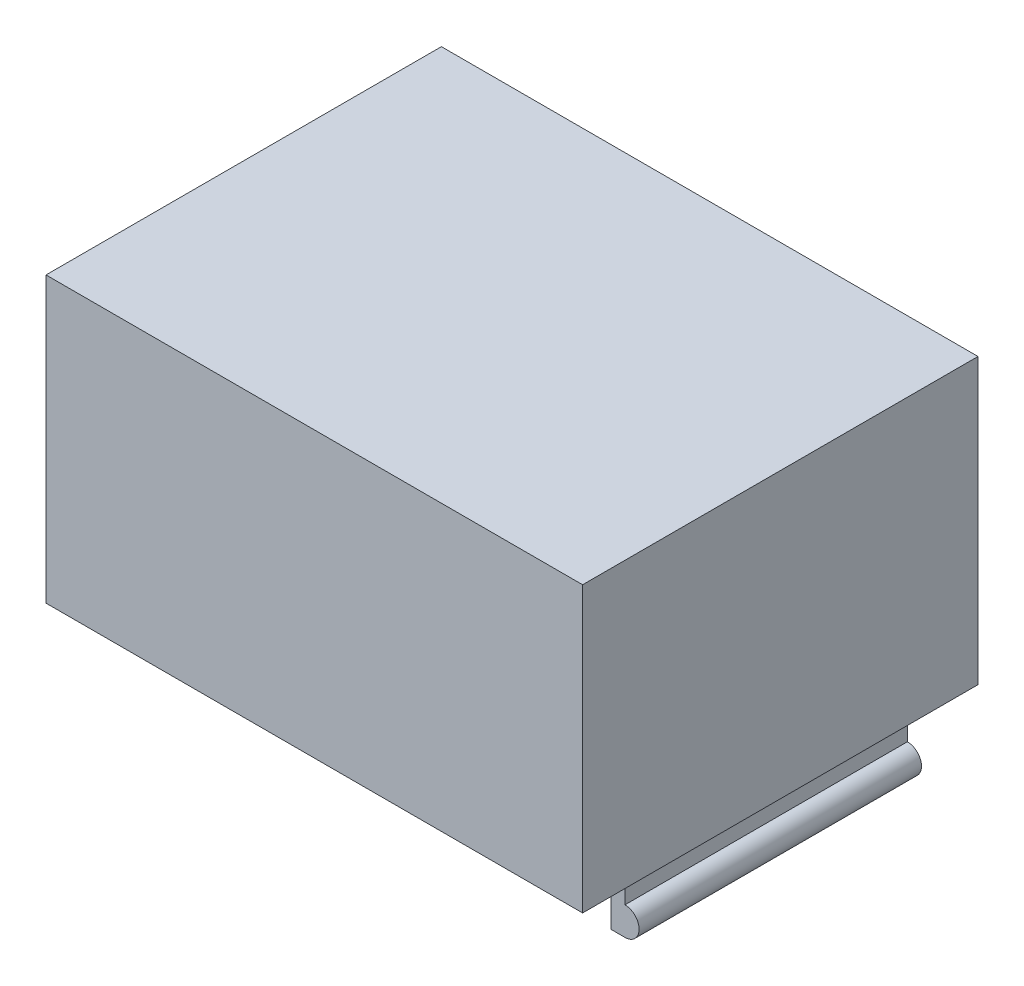
ISO-10303-21;
HEADER;
FILE_DESCRIPTION(('STEP AP214'),'2;1');
FILE_NAME('part.step','',(''),(''),'','','');
FILE_SCHEMA(('AUTOMOTIVE_DESIGN { 1 0 10303 214 1 1 1 1 }'));
ENDSEC;
DATA;
#1=APPLICATION_CONTEXT('core data for automotive mechanical design processes');
#2=APPLICATION_PROTOCOL_DEFINITION('international standard','automotive_design',2000,#1);
#3=PRODUCT_CONTEXT('',#1,'mechanical');
#4=PRODUCT('Part','Part','',(#3));
#5=PRODUCT_RELATED_PRODUCT_CATEGORY('part','',(#4));
#6=PRODUCT_DEFINITION_FORMATION('','',#4);
#7=PRODUCT_DEFINITION_CONTEXT('part definition',#1,'design');
#8=PRODUCT_DEFINITION('design','',#6,#7);
#9=PRODUCT_DEFINITION_SHAPE('','',#8);
#10=(LENGTH_UNIT() NAMED_UNIT(*) SI_UNIT(.MILLI.,.METRE.));
#11=(NAMED_UNIT(*) PLANE_ANGLE_UNIT() SI_UNIT($,.RADIAN.));
#12=(NAMED_UNIT(*) SI_UNIT($,.STERADIAN.) SOLID_ANGLE_UNIT());
#13=UNCERTAINTY_MEASURE_WITH_UNIT(LENGTH_MEASURE(1.E-05),#10,'distance_accuracy_value','');
#14=(GEOMETRIC_REPRESENTATION_CONTEXT(3) GLOBAL_UNCERTAINTY_ASSIGNED_CONTEXT((#13)) GLOBAL_UNIT_ASSIGNED_CONTEXT((#10,
#11,#12)) REPRESENTATION_CONTEXT('',''));
#15=CARTESIAN_POINT('',(0.,0.,0.));
#16=DIRECTION('',(0.,0.,1.));
#17=DIRECTION('',(1.,0.,0.));
#18=AXIS2_PLACEMENT_3D('',#15,#16,#17);
#19=CARTESIAN_POINT('',(0.,-25.5651,17.78));
#20=DIRECTION('',(0.,1.,0.));
#21=DIRECTION('',(0.,0.,1.));
#22=AXIS2_PLACEMENT_3D('',#19,#20,#21);
#23=PLANE('',#22);
#24=DIRECTION('',(0.,0.,-1.));
#25=VECTOR('',#24,1.);
#26=CARTESIAN_POINT('',(2.54,-25.5651,17.78));
#27=LINE('',#26,#25);
#28=CARTESIAN_POINT('',(2.54,-25.5651,-12.7));
#29=VERTEX_POINT('',#28);
#30=CARTESIAN_POINT('',(2.54,-25.5651,-15.24));
#31=VERTEX_POINT('',#30);
#32=EDGE_CURVE('E292',#29,#31,#27,.T.);
#33=ORIENTED_EDGE('',*,*,#32,.F.);
#34=DIRECTION('',(-1.,0.,0.));
#35=VECTOR('',#34,1.);
#36=CARTESIAN_POINT('',(1.27,-25.5651,-12.7));
#37=LINE('',#36,#35);
#38=CARTESIAN_POINT('',(1.27,-25.5651,-12.7));
#39=VERTEX_POINT('',#38);
#40=EDGE_CURVE('E63',#29,#39,#37,.T.);
#41=ORIENTED_EDGE('',*,*,#40,.T.);
#42=DIRECTION('',(0.,0.,-1.));
#43=VECTOR('',#42,1.);
#44=CARTESIAN_POINT('',(1.27,-25.5651,12.7));
#45=LINE('',#44,#43);
#46=CARTESIAN_POINT('',(1.27,-25.5651,12.7));
#47=VERTEX_POINT('',#46);
#48=EDGE_CURVE('E589',#47,#39,#45,.T.);
#49=ORIENTED_EDGE('',*,*,#48,.F.);
#50=DIRECTION('',(-1.,0.,0.));
#51=VECTOR('',#50,1.);
#52=CARTESIAN_POINT('',(1.27,-25.5651,12.7));
#53=LINE('',#52,#51);
#54=CARTESIAN_POINT('',(2.54,-25.5651,12.7));
#55=VERTEX_POINT('',#54);
#56=EDGE_CURVE('E187',#55,#47,#53,.T.);
#57=ORIENTED_EDGE('',*,*,#56,.F.);
#58=CARTESIAN_POINT('',(2.54,-25.5651,15.24));
#59=VERTEX_POINT('',#58);
#60=EDGE_CURVE('E286',#59,#55,#27,.T.);
#61=ORIENTED_EDGE('',*,*,#60,.F.);
#62=DIRECTION('',(1.,0.,0.));
#63=VECTOR('',#62,1.);
#64=CARTESIAN_POINT('',(0.,-25.5651,15.24));
#65=LINE('',#64,#63);
#66=CARTESIAN_POINT('',(45.72,-25.5651,15.24));
#67=VERTEX_POINT('',#66);
#68=EDGE_CURVE('E265',#59,#67,#65,.T.);
#69=ORIENTED_EDGE('',*,*,#68,.T.);
#70=DIRECTION('',(0.,0.,-1.));
#71=VECTOR('',#70,1.);
#72=CARTESIAN_POINT('',(45.72,-25.5651,17.78));
#73=LINE('',#72,#71);
#74=CARTESIAN_POINT('',(45.72,-25.5651,12.7));
#75=VERTEX_POINT('',#74);
#76=EDGE_CURVE('E293',#67,#75,#73,.T.);
#77=ORIENTED_EDGE('',*,*,#76,.T.);
#78=DIRECTION('',(-1.,0.,0.));
#79=VECTOR('',#78,1.);
#80=CARTESIAN_POINT('',(46.99,-25.5651,12.7));
#81=LINE('',#80,#79);
#82=CARTESIAN_POINT('',(46.99,-25.5651,12.7));
#83=VERTEX_POINT('',#82);
#84=EDGE_CURVE('E227',#83,#75,#81,.T.);
#85=ORIENTED_EDGE('',*,*,#84,.F.);
#86=DIRECTION('',(0.,0.,-1.));
#87=VECTOR('',#86,1.);
#88=CARTESIAN_POINT('',(46.99,-25.5651,12.7));
#89=LINE('',#88,#87);
#90=CARTESIAN_POINT('',(46.99,-25.5651,-12.7));
#91=VERTEX_POINT('',#90);
#92=EDGE_CURVE('E222',#83,#91,#89,.T.);
#93=ORIENTED_EDGE('',*,*,#92,.T.);
#94=DIRECTION('',(-1.,0.,0.));
#95=VECTOR('',#94,1.);
#96=CARTESIAN_POINT('',(46.99,-25.5651,-12.7));
#97=LINE('',#96,#95);
#98=CARTESIAN_POINT('',(45.72,-25.5651,-12.7));
#99=VERTEX_POINT('',#98);
#100=EDGE_CURVE('E67',#91,#99,#97,.T.);
#101=ORIENTED_EDGE('',*,*,#100,.T.);
#102=CARTESIAN_POINT('',(45.72,-25.5651,-15.24));
#103=VERTEX_POINT('',#102);
#104=EDGE_CURVE('E276',#99,#103,#73,.T.);
#105=ORIENTED_EDGE('',*,*,#104,.T.);
#106=DIRECTION('',(1.,0.,0.));
#107=VECTOR('',#106,1.);
#108=CARTESIAN_POINT('',(0.,-25.5651,-15.24));
#109=LINE('',#108,#107);
#110=EDGE_CURVE('E256',#31,#103,#109,.T.);
#111=ORIENTED_EDGE('',*,*,#110,.F.);
#112=EDGE_LOOP('',(#33,#41,#49,#57,#61,#69,#77,#85,#93,#101,#105,#111));
#113=FACE_BOUND('',#112,.T.);
#114=DIRECTION('',(1.,0.,0.));
#115=VECTOR('',#114,1.);
#116=CARTESIAN_POINT('',(0.,-25.5651,-17.78));
#117=LINE('',#116,#115);
#118=CARTESIAN_POINT('',(0.,-25.5651,-17.78));
#119=VERTEX_POINT('',#118);
#120=CARTESIAN_POINT('',(48.26,-25.5651,-17.78));
#121=VERTEX_POINT('',#120);
#122=EDGE_CURVE('E325',#119,#121,#117,.T.);
#123=ORIENTED_EDGE('',*,*,#122,.T.);
#124=DIRECTION('',(0.,0.,-1.));
#125=VECTOR('',#124,1.);
#126=CARTESIAN_POINT('',(48.26,-25.5651,17.78));
#127=LINE('',#126,#125);
#128=CARTESIAN_POINT('',(48.26,-25.5651,17.78));
#129=VERTEX_POINT('',#128);
#130=EDGE_CURVE('E336',#129,#121,#127,.T.);
#131=ORIENTED_EDGE('',*,*,#130,.F.);
#132=DIRECTION('',(1.,0.,0.));
#133=VECTOR('',#132,1.);
#134=CARTESIAN_POINT('',(0.,-25.5651,17.78));
#135=LINE('',#134,#133);
#136=CARTESIAN_POINT('',(0.,-25.5651,17.78));
#137=VERTEX_POINT('',#136);
#138=EDGE_CURVE('E308',#137,#129,#135,.T.);
#139=ORIENTED_EDGE('',*,*,#138,.F.);
#140=DIRECTION('',(0.,0.,-1.));
#141=VECTOR('',#140,1.);
#142=CARTESIAN_POINT('',(0.,-25.5651,17.78));
#143=LINE('',#142,#141);
#144=EDGE_CURVE('E53',#137,#119,#143,.T.);
#145=ORIENTED_EDGE('',*,*,#144,.T.);
#146=EDGE_LOOP('',(#123,#131,#139,#145));
#147=FACE_BOUND('',#146,.T.);
#148=ADVANCED_FACE('F44',(#113,#147),#23,.F.);
#149=CARTESIAN_POINT('',(0.,0.,17.78));
#150=DIRECTION('',(1.,0.,0.));
#151=DIRECTION('',(0.,1.,0.));
#152=AXIS2_PLACEMENT_3D('',#149,#150,#151);
#153=PLANE('',#152);
#154=DIRECTION('',(0.,-1.,0.));
#155=VECTOR('',#154,1.);
#156=CARTESIAN_POINT('',(0.,0.,-17.78));
#157=LINE('',#156,#155);
#158=CARTESIAN_POINT('',(0.,0.,-17.78));
#159=VERTEX_POINT('',#158);
#160=EDGE_CURVE('E289',#159,#119,#157,.T.);
#161=ORIENTED_EDGE('',*,*,#160,.T.);
#162=ORIENTED_EDGE('',*,*,#144,.F.);
#163=DIRECTION('',(0.,-1.,0.));
#164=VECTOR('',#163,1.);
#165=CARTESIAN_POINT('',(0.,0.,17.78));
#166=LINE('',#165,#164);
#167=CARTESIAN_POINT('',(0.,0.,17.78));
#168=VERTEX_POINT('',#167);
#169=EDGE_CURVE('E305',#168,#137,#166,.T.);
#170=ORIENTED_EDGE('',*,*,#169,.F.);
#171=DIRECTION('',(0.,0.,-1.));
#172=VECTOR('',#171,1.);
#173=CARTESIAN_POINT('',(0.,0.,17.78));
#174=LINE('',#173,#172);
#175=EDGE_CURVE('E318',#168,#159,#174,.T.);
#176=ORIENTED_EDGE('',*,*,#175,.T.);
#177=EDGE_LOOP('',(#161,#162,#170,#176));
#178=FACE_BOUND('',#177,.T.);
#179=ADVANCED_FACE('F50',(#178),#153,.F.);
#180=CARTESIAN_POINT('',(48.26,0.,17.78));
#181=DIRECTION('',(1.,0.,0.));
#182=DIRECTION('',(0.,0.,-1.));
#183=AXIS2_PLACEMENT_3D('',#180,#181,#182);
#184=PLANE('',#183);
#185=DIRECTION('',(0.,-1.,0.));
#186=VECTOR('',#185,1.);
#187=CARTESIAN_POINT('',(48.26,0.,-17.78));
#188=LINE('',#187,#186);
#189=CARTESIAN_POINT('',(48.26,0.,-17.78));
#190=VERTEX_POINT('',#189);
#191=EDGE_CURVE('E326',#190,#121,#188,.T.);
#192=ORIENTED_EDGE('',*,*,#191,.F.);
#193=DIRECTION('',(0.,0.,-1.));
#194=VECTOR('',#193,1.);
#195=CARTESIAN_POINT('',(48.26,0.,17.78));
#196=LINE('',#195,#194);
#197=CARTESIAN_POINT('',(48.26,0.,17.78));
#198=VERTEX_POINT('',#197);
#199=EDGE_CURVE('E333',#198,#190,#196,.T.);
#200=ORIENTED_EDGE('',*,*,#199,.F.);
#201=DIRECTION('',(0.,-1.,0.));
#202=VECTOR('',#201,1.);
#203=CARTESIAN_POINT('',(48.26,0.,17.78));
#204=LINE('',#203,#202);
#205=EDGE_CURVE('E309',#198,#129,#204,.T.);
#206=ORIENTED_EDGE('',*,*,#205,.T.);
#207=ORIENTED_EDGE('',*,*,#130,.T.);
#208=EDGE_LOOP('',(#192,#200,#206,#207));
#209=FACE_BOUND('',#208,.T.);
#210=ADVANCED_FACE('F360',(#209),#184,.T.);
#211=CARTESIAN_POINT('',(0.,0.,17.78));
#212=DIRECTION('',(0.,1.,0.));
#213=DIRECTION('',(0.,0.,1.));
#214=AXIS2_PLACEMENT_3D('',#211,#212,#213);
#215=PLANE('',#214);
#216=DIRECTION('',(1.,0.,0.));
#217=VECTOR('',#216,1.);
#218=CARTESIAN_POINT('',(0.,0.,-17.78));
#219=LINE('',#218,#217);
#220=EDGE_CURVE('E307',#159,#190,#219,.T.);
#221=ORIENTED_EDGE('',*,*,#220,.F.);
#222=ORIENTED_EDGE('',*,*,#175,.F.);
#223=DIRECTION('',(1.,0.,0.));
#224=VECTOR('',#223,1.);
#225=CARTESIAN_POINT('',(0.,0.,17.78));
#226=LINE('',#225,#224);
#227=EDGE_CURVE('E314',#168,#198,#226,.T.);
#228=ORIENTED_EDGE('',*,*,#227,.T.);
#229=ORIENTED_EDGE('',*,*,#199,.T.);
#230=EDGE_LOOP('',(#221,#222,#228,#229));
#231=FACE_BOUND('',#230,.T.);
#232=ADVANCED_FACE('F355',(#231),#215,.T.);
#233=CARTESIAN_POINT('',(0.,0.,17.78));
#234=DIRECTION('',(0.,0.,1.));
#235=DIRECTION('',(1.,0.,0.));
#236=AXIS2_PLACEMENT_3D('',#233,#234,#235);
#237=PLANE('',#236);
#238=ORIENTED_EDGE('',*,*,#169,.T.);
#239=ORIENTED_EDGE('',*,*,#138,.T.);
#240=ORIENTED_EDGE('',*,*,#205,.F.);
#241=ORIENTED_EDGE('',*,*,#227,.F.);
#242=EDGE_LOOP('',(#238,#239,#240,#241));
#243=FACE_BOUND('',#242,.T.);
#244=ADVANCED_FACE('F357',(#243),#237,.T.);
#245=CARTESIAN_POINT('',(0.,0.,-17.78));
#246=DIRECTION('',(0.,0.,1.));
#247=DIRECTION('',(1.,0.,0.));
#248=AXIS2_PLACEMENT_3D('',#245,#246,#247);
#249=PLANE('',#248);
#250=ORIENTED_EDGE('',*,*,#160,.F.);
#251=ORIENTED_EDGE('',*,*,#220,.T.);
#252=ORIENTED_EDGE('',*,*,#191,.T.);
#253=ORIENTED_EDGE('',*,*,#122,.F.);
#254=EDGE_LOOP('',(#250,#251,#252,#253));
#255=FACE_BOUND('',#254,.T.);
#256=ADVANCED_FACE('F348',(#255),#249,.F.);
#257=CARTESIAN_POINT('',(2.54,0.,17.78));
#258=DIRECTION('',(1.,0.,0.));
#259=DIRECTION('',(0.,1.,0.));
#260=AXIS2_PLACEMENT_3D('',#257,#258,#259);
#261=PLANE('',#260);
#262=DIRECTION('',(0.,-1.,0.));
#263=VECTOR('',#262,1.);
#264=CARTESIAN_POINT('',(2.54,0.,-15.24));
#265=LINE('',#264,#263);
#266=CARTESIAN_POINT('',(2.54,-2.54,-15.24));
#267=VERTEX_POINT('',#266);
#268=EDGE_CURVE('E201',#267,#31,#265,.T.);
#269=ORIENTED_EDGE('',*,*,#268,.F.);
#270=DIRECTION('',(0.,0.,-1.));
#271=VECTOR('',#270,1.);
#272=CARTESIAN_POINT('',(2.54,-2.54,17.78));
#273=LINE('',#272,#271);
#274=CARTESIAN_POINT('',(2.54,-2.54,15.24));
#275=VERTEX_POINT('',#274);
#276=EDGE_CURVE('E262',#275,#267,#273,.T.);
#277=ORIENTED_EDGE('',*,*,#276,.F.);
#278=DIRECTION('',(0.,-1.,0.));
#279=VECTOR('',#278,1.);
#280=CARTESIAN_POINT('',(2.54,0.,15.24));
#281=LINE('',#280,#279);
#282=EDGE_CURVE('E259',#275,#59,#281,.T.);
#283=ORIENTED_EDGE('',*,*,#282,.T.);
#284=ORIENTED_EDGE('',*,*,#60,.T.);
#285=DIRECTION('',(0.,1.,0.));
#286=VECTOR('',#285,1.);
#287=CARTESIAN_POINT('',(2.54,-25.5651,12.7));
#288=LINE('',#287,#286);
#289=CARTESIAN_POINT('',(2.54,-30.6451,12.7));
#290=VERTEX_POINT('',#289);
#291=EDGE_CURVE('E596',#290,#55,#288,.T.);
#292=ORIENTED_EDGE('',*,*,#291,.F.);
#293=DIRECTION('',(0.,0.,-1.));
#294=VECTOR('',#293,1.);
#295=CARTESIAN_POINT('',(2.54,-30.6451,12.7));
#296=LINE('',#295,#294);
#297=CARTESIAN_POINT('',(2.54,-30.6451,-12.7));
#298=VERTEX_POINT('',#297);
#299=EDGE_CURVE('E202',#290,#298,#296,.T.);
#300=ORIENTED_EDGE('',*,*,#299,.T.);
#301=DIRECTION('',(0.,1.,0.));
#302=VECTOR('',#301,1.);
#303=CARTESIAN_POINT('',(2.54,-25.5651,-12.7));
#304=LINE('',#303,#302);
#305=EDGE_CURVE('E581',#298,#29,#304,.T.);
#306=ORIENTED_EDGE('',*,*,#305,.T.);
#307=ORIENTED_EDGE('',*,*,#32,.T.);
#308=EDGE_LOOP('',(#269,#277,#283,#284,#292,#300,#306,#307));
#309=FACE_BOUND('',#308,.T.);
#310=ADVANCED_FACE('F368',(#309),#261,.T.);
#311=CARTESIAN_POINT('',(45.72,0.,17.78));
#312=DIRECTION('',(1.,0.,0.));
#313=DIRECTION('',(0.,0.,-1.));
#314=AXIS2_PLACEMENT_3D('',#311,#312,#313);
#315=PLANE('',#314);
#316=DIRECTION('',(0.,-1.,0.));
#317=VECTOR('',#316,1.);
#318=CARTESIAN_POINT('',(45.72,0.,-15.24));
#319=LINE('',#318,#317);
#320=CARTESIAN_POINT('',(45.72,-2.54,-15.24));
#321=VERTEX_POINT('',#320);
#322=EDGE_CURVE('E275',#321,#103,#319,.T.);
#323=ORIENTED_EDGE('',*,*,#322,.T.);
#324=ORIENTED_EDGE('',*,*,#104,.F.);
#325=DIRECTION('',(0.,-1.,0.));
#326=VECTOR('',#325,1.);
#327=CARTESIAN_POINT('',(45.72,-25.5651,-12.7));
#328=LINE('',#327,#326);
#329=CARTESIAN_POINT('',(45.72,-30.6451,-12.7));
#330=VERTEX_POINT('',#329);
#331=EDGE_CURVE('E237',#99,#330,#328,.T.);
#332=ORIENTED_EDGE('',*,*,#331,.T.);
#333=DIRECTION('',(0.,0.,-1.));
#334=VECTOR('',#333,1.);
#335=CARTESIAN_POINT('',(45.72,-30.6451,12.7));
#336=LINE('',#335,#334);
#337=CARTESIAN_POINT('',(45.72,-30.6451,12.7));
#338=VERTEX_POINT('',#337);
#339=EDGE_CURVE('E207',#338,#330,#336,.T.);
#340=ORIENTED_EDGE('',*,*,#339,.F.);
#341=DIRECTION('',(0.,-1.,0.));
#342=VECTOR('',#341,1.);
#343=CARTESIAN_POINT('',(45.72,-25.5651,12.7));
#344=LINE('',#343,#342);
#345=EDGE_CURVE('E247',#75,#338,#344,.T.);
#346=ORIENTED_EDGE('',*,*,#345,.F.);
#347=ORIENTED_EDGE('',*,*,#76,.F.);
#348=DIRECTION('',(0.,-1.,0.));
#349=VECTOR('',#348,1.);
#350=CARTESIAN_POINT('',(45.72,0.,15.24));
#351=LINE('',#350,#349);
#352=CARTESIAN_POINT('',(45.72,-2.54,15.24));
#353=VERTEX_POINT('',#352);
#354=EDGE_CURVE('E277',#353,#67,#351,.T.);
#355=ORIENTED_EDGE('',*,*,#354,.F.);
#356=DIRECTION('',(0.,0.,-1.));
#357=VECTOR('',#356,1.);
#358=CARTESIAN_POINT('',(45.72,-2.54,17.78));
#359=LINE('',#358,#357);
#360=EDGE_CURVE('E270',#353,#321,#359,.T.);
#361=ORIENTED_EDGE('',*,*,#360,.T.);
#362=EDGE_LOOP('',(#323,#324,#332,#340,#346,#347,#355,#361));
#363=FACE_BOUND('',#362,.T.);
#364=ADVANCED_FACE('F415',(#363),#315,.F.);
#365=CARTESIAN_POINT('',(0.,-2.54,17.78));
#366=DIRECTION('',(0.,1.,0.));
#367=DIRECTION('',(0.,0.,1.));
#368=AXIS2_PLACEMENT_3D('',#365,#366,#367);
#369=PLANE('',#368);
#370=CARTESIAN_POINT('',(27.94,-2.54,0.));
#371=DIRECTION('',(0.,1.,0.));
#372=DIRECTION('',(0.,0.,1.));
#373=AXIS2_PLACEMENT_3D('',#370,#371,#372);
#374=CIRCLE('',#373,3.175);
#375=CARTESIAN_POINT('',(27.94,-2.54,3.175));
#376=VERTEX_POINT('',#375);
#377=EDGE_CURVE('E11',#376,#376,#374,.F.);
#378=ORIENTED_EDGE('',*,*,#377,.F.);
#379=EDGE_LOOP('',(#378));
#380=FACE_BOUND('',#379,.T.);
#381=DIRECTION('',(1.,0.,0.));
#382=VECTOR('',#381,1.);
#383=CARTESIAN_POINT('',(0.,-2.54,-15.24));
#384=LINE('',#383,#382);
#385=EDGE_CURVE('E263',#267,#321,#384,.T.);
#386=ORIENTED_EDGE('',*,*,#385,.T.);
#387=ORIENTED_EDGE('',*,*,#360,.F.);
#388=DIRECTION('',(1.,0.,0.));
#389=VECTOR('',#388,1.);
#390=CARTESIAN_POINT('',(0.,-2.54,15.24));
#391=LINE('',#390,#389);
#392=EDGE_CURVE('E268',#275,#353,#391,.T.);
#393=ORIENTED_EDGE('',*,*,#392,.F.);
#394=ORIENTED_EDGE('',*,*,#276,.T.);
#395=EDGE_LOOP('',(#386,#387,#393,#394));
#396=FACE_BOUND('',#395,.T.);
#397=ADVANCED_FACE('F422',(#380,#396),#369,.F.);
#398=CARTESIAN_POINT('',(0.,0.,15.24));
#399=DIRECTION('',(0.,0.,1.));
#400=DIRECTION('',(1.,0.,0.));
#401=AXIS2_PLACEMENT_3D('',#398,#399,#400);
#402=PLANE('',#401);
#403=ORIENTED_EDGE('',*,*,#282,.F.);
#404=ORIENTED_EDGE('',*,*,#392,.T.);
#405=ORIENTED_EDGE('',*,*,#354,.T.);
#406=ORIENTED_EDGE('',*,*,#68,.F.);
#407=EDGE_LOOP('',(#403,#404,#405,#406));
#408=FACE_BOUND('',#407,.T.);
#409=ADVANCED_FACE('F440',(#408),#402,.F.);
#410=CARTESIAN_POINT('',(0.,0.,-15.24));
#411=DIRECTION('',(0.,0.,1.));
#412=DIRECTION('',(1.,0.,0.));
#413=AXIS2_PLACEMENT_3D('',#410,#411,#412);
#414=PLANE('',#413);
#415=ORIENTED_EDGE('',*,*,#268,.T.);
#416=ORIENTED_EDGE('',*,*,#110,.T.);
#417=ORIENTED_EDGE('',*,*,#322,.F.);
#418=ORIENTED_EDGE('',*,*,#385,.F.);
#419=EDGE_LOOP('',(#415,#416,#417,#418));
#420=FACE_BOUND('',#419,.T.);
#421=ADVANCED_FACE('F446',(#420),#414,.T.);
#422=CARTESIAN_POINT('',(27.94,-27.94,0.));
#423=DIRECTION('',(0.,1.,0.));
#424=DIRECTION('',(0.,0.,1.));
#425=AXIS2_PLACEMENT_3D('',#422,#423,#424);
#426=CYLINDRICAL_SURFACE('',#425,3.175);
#427=CARTESIAN_POINT('',(27.94,-27.94,0.));
#428=DIRECTION('',(0.,-1.,0.));
#429=DIRECTION('',(0.,0.,-1.));
#430=AXIS2_PLACEMENT_3D('',#427,#428,#429);
#431=CIRCLE('',#430,3.175);
#432=CARTESIAN_POINT('',(27.94,-27.94,-3.175));
#433=VERTEX_POINT('',#432);
#434=EDGE_CURVE('E196',#433,#433,#431,.T.);
#435=ORIENTED_EDGE('',*,*,#434,.F.);
#436=EDGE_LOOP('',(#435));
#437=FACE_BOUND('',#436,.T.);
#438=ORIENTED_EDGE('',*,*,#377,.T.);
#439=EDGE_LOOP('',(#438));
#440=FACE_BOUND('',#439,.T.);
#441=ADVANCED_FACE('F460',(#437,#440),#426,.T.);
#442=CARTESIAN_POINT('',(27.94,-27.94,0.));
#443=DIRECTION('',(0.,-1.,0.));
#444=DIRECTION('',(0.,0.,-1.));
#445=AXIS2_PLACEMENT_3D('',#442,#443,#444);
#446=PLANE('',#445);
#447=ORIENTED_EDGE('',*,*,#434,.T.);
#448=EDGE_LOOP('',(#447));
#449=FACE_BOUND('',#448,.T.);
#450=ADVANCED_FACE('F464',(#449),#446,.T.);
#451=CARTESIAN_POINT('',(45.72,-30.6451,12.7));
#452=DIRECTION('',(0.,1.,0.));
#453=DIRECTION('',(0.,0.,1.));
#454=AXIS2_PLACEMENT_3D('',#451,#452,#453);
#455=PLANE('',#454);
#456=DIRECTION('',(1.,0.,0.));
#457=VECTOR('',#456,1.);
#458=CARTESIAN_POINT('',(45.72,-30.6451,-12.7));
#459=LINE('',#458,#457);
#460=CARTESIAN_POINT('',(46.99,-30.6451,-12.7));
#461=VERTEX_POINT('',#460);
#462=EDGE_CURVE('E233',#330,#461,#459,.T.);
#463=ORIENTED_EDGE('',*,*,#462,.T.);
#464=DIRECTION('',(0.,0.,-1.));
#465=VECTOR('',#464,1.);
#466=CARTESIAN_POINT('',(46.99,-30.6451,12.7));
#467=LINE('',#466,#465);
#468=CARTESIAN_POINT('',(46.99,-30.6451,12.7));
#469=VERTEX_POINT('',#468);
#470=EDGE_CURVE('E213',#469,#461,#467,.T.);
#471=ORIENTED_EDGE('',*,*,#470,.F.);
#472=DIRECTION('',(1.,0.,0.));
#473=VECTOR('',#472,1.);
#474=CARTESIAN_POINT('',(45.72,-30.6451,12.7));
#475=LINE('',#474,#473);
#476=EDGE_CURVE('E246',#338,#469,#475,.T.);
#477=ORIENTED_EDGE('',*,*,#476,.F.);
#478=ORIENTED_EDGE('',*,*,#339,.T.);
#479=EDGE_LOOP('',(#463,#471,#477,#478));
#480=FACE_BOUND('',#479,.T.);
#481=ADVANCED_FACE('F472',(#480),#455,.F.);
#482=CARTESIAN_POINT('',(46.99,-29.3751,12.7));
#483=DIRECTION('',(0.,0.,-1.));
#484=DIRECTION('',(-1.,0.,0.));
#485=AXIS2_PLACEMENT_3D('',#482,#483,#484);
#486=CYLINDRICAL_SURFACE('',#485,1.27);
#487=CARTESIAN_POINT('',(46.99,-29.3751,-12.7));
#488=DIRECTION('',(0.,0.,1.));
#489=DIRECTION('',(1.,0.,0.));
#490=AXIS2_PLACEMENT_3D('',#487,#488,#489);
#491=CIRCLE('',#490,1.27);
#492=CARTESIAN_POINT('',(46.99,-28.1051,-12.7));
#493=VERTEX_POINT('',#492);
#494=EDGE_CURVE('E229',#461,#493,#491,.T.);
#495=ORIENTED_EDGE('',*,*,#494,.T.);
#496=DIRECTION('',(0.,0.,-1.));
#497=VECTOR('',#496,1.);
#498=CARTESIAN_POINT('',(46.99,-28.1051,12.7));
#499=LINE('',#498,#497);
#500=CARTESIAN_POINT('',(46.99,-28.1051,12.7));
#501=VERTEX_POINT('',#500);
#502=EDGE_CURVE('E220',#501,#493,#499,.T.);
#503=ORIENTED_EDGE('',*,*,#502,.F.);
#504=CARTESIAN_POINT('',(46.99,-29.3751,12.7));
#505=DIRECTION('',(0.,0.,1.));
#506=DIRECTION('',(1.,0.,0.));
#507=AXIS2_PLACEMENT_3D('',#504,#505,#506);
#508=CIRCLE('',#507,1.27);
#509=EDGE_CURVE('E241',#469,#501,#508,.T.);
#510=ORIENTED_EDGE('',*,*,#509,.F.);
#511=ORIENTED_EDGE('',*,*,#470,.T.);
#512=EDGE_LOOP('',(#495,#503,#510,#511));
#513=FACE_BOUND('',#512,.T.);
#514=ADVANCED_FACE('F481',(#513),#486,.T.);
#515=CARTESIAN_POINT('',(46.99,-28.1051,12.7));
#516=DIRECTION('',(-1.,0.,0.));
#517=DIRECTION('',(0.,0.,1.));
#518=AXIS2_PLACEMENT_3D('',#515,#516,#517);
#519=PLANE('',#518);
#520=DIRECTION('',(0.,1.,0.));
#521=VECTOR('',#520,1.);
#522=CARTESIAN_POINT('',(46.99,-28.1051,-12.7));
#523=LINE('',#522,#521);
#524=EDGE_CURVE('E228',#493,#91,#523,.T.);
#525=ORIENTED_EDGE('',*,*,#524,.T.);
#526=ORIENTED_EDGE('',*,*,#92,.F.);
#527=DIRECTION('',(0.,1.,0.));
#528=VECTOR('',#527,1.);
#529=CARTESIAN_POINT('',(46.99,-28.1051,12.7));
#530=LINE('',#529,#528);
#531=EDGE_CURVE('E223',#501,#83,#530,.T.);
#532=ORIENTED_EDGE('',*,*,#531,.F.);
#533=ORIENTED_EDGE('',*,*,#502,.T.);
#534=EDGE_LOOP('',(#525,#526,#532,#533));
#535=FACE_BOUND('',#534,.T.);
#536=ADVANCED_FACE('F489',(#535),#519,.F.);
#537=CARTESIAN_POINT('',(46.99,-29.3751,12.7));
#538=DIRECTION('',(0.,0.,1.));
#539=DIRECTION('',(1.,0.,0.));
#540=AXIS2_PLACEMENT_3D('',#537,#538,#539);
#541=PLANE('',#540);
#542=ORIENTED_EDGE('',*,*,#84,.T.);
#543=ORIENTED_EDGE('',*,*,#345,.T.);
#544=ORIENTED_EDGE('',*,*,#476,.T.);
#545=ORIENTED_EDGE('',*,*,#509,.T.);
#546=ORIENTED_EDGE('',*,*,#531,.T.);
#547=EDGE_LOOP('',(#542,#543,#544,#545,#546));
#548=FACE_BOUND('',#547,.T.);
#549=ADVANCED_FACE('F496',(#548),#541,.T.);
#550=CARTESIAN_POINT('',(46.99,-29.3751,-12.7));
#551=DIRECTION('',(0.,0.,1.));
#552=DIRECTION('',(1.,0.,0.));
#553=AXIS2_PLACEMENT_3D('',#550,#551,#552);
#554=PLANE('',#553);
#555=ORIENTED_EDGE('',*,*,#100,.F.);
#556=ORIENTED_EDGE('',*,*,#524,.F.);
#557=ORIENTED_EDGE('',*,*,#494,.F.);
#558=ORIENTED_EDGE('',*,*,#462,.F.);
#559=ORIENTED_EDGE('',*,*,#331,.F.);
#560=EDGE_LOOP('',(#555,#556,#557,#558,#559));
#561=FACE_BOUND('',#560,.T.);
#562=ADVANCED_FACE('F508',(#561),#554,.F.);
#563=CARTESIAN_POINT('',(1.27,-28.1051,12.7));
#564=DIRECTION('',(1.,0.,0.));
#565=DIRECTION('',(0.,1.,0.));
#566=AXIS2_PLACEMENT_3D('',#563,#564,#565);
#567=PLANE('',#566);
#568=DIRECTION('',(0.,-1.,0.));
#569=VECTOR('',#568,1.);
#570=CARTESIAN_POINT('',(1.27,-28.1051,-12.7));
#571=LINE('',#570,#569);
#572=CARTESIAN_POINT('',(1.27,-28.1051,-12.7));
#573=VERTEX_POINT('',#572);
#574=EDGE_CURVE('E198',#39,#573,#571,.T.);
#575=ORIENTED_EDGE('',*,*,#574,.T.);
#576=DIRECTION('',(0.,0.,-1.));
#577=VECTOR('',#576,1.);
#578=CARTESIAN_POINT('',(1.27,-28.1051,12.7));
#579=LINE('',#578,#577);
#580=CARTESIAN_POINT('',(1.27,-28.1051,12.7));
#581=VERTEX_POINT('',#580);
#582=EDGE_CURVE('E176',#581,#573,#579,.T.);
#583=ORIENTED_EDGE('',*,*,#582,.F.);
#584=DIRECTION('',(0.,-1.,0.));
#585=VECTOR('',#584,1.);
#586=CARTESIAN_POINT('',(1.27,-28.1051,12.7));
#587=LINE('',#586,#585);
#588=EDGE_CURVE('E184',#47,#581,#587,.T.);
#589=ORIENTED_EDGE('',*,*,#588,.F.);
#590=ORIENTED_EDGE('',*,*,#48,.T.);
#591=EDGE_LOOP('',(#575,#583,#589,#590));
#592=FACE_BOUND('',#591,.T.);
#593=ADVANCED_FACE('F192',(#592),#567,.F.);
#594=CARTESIAN_POINT('',(1.27,-29.3751,12.7));
#595=DIRECTION('',(0.,0.,-1.));
#596=DIRECTION('',(-1.,0.,0.));
#597=AXIS2_PLACEMENT_3D('',#594,#595,#596);
#598=CYLINDRICAL_SURFACE('',#597,1.27);
#599=CARTESIAN_POINT('',(1.27,-29.3751,-12.7));
#600=DIRECTION('',(0.,0.,1.));
#601=DIRECTION('',(-1.,0.,0.));
#602=AXIS2_PLACEMENT_3D('',#599,#600,#601);
#603=CIRCLE('',#602,1.27);
#604=CARTESIAN_POINT('',(1.27,-30.6451,-12.7));
#605=VERTEX_POINT('',#604);
#606=EDGE_CURVE('E575',#573,#605,#603,.T.);
#607=ORIENTED_EDGE('',*,*,#606,.T.);
#608=DIRECTION('',(0.,0.,-1.));
#609=VECTOR('',#608,1.);
#610=CARTESIAN_POINT('',(1.27,-30.6451,12.7));
#611=LINE('',#610,#609);
#612=CARTESIAN_POINT('',(1.27,-30.6451,12.7));
#613=VERTEX_POINT('',#612);
#614=EDGE_CURVE('E177',#613,#605,#611,.T.);
#615=ORIENTED_EDGE('',*,*,#614,.F.);
#616=CARTESIAN_POINT('',(1.27,-29.3751,12.7));
#617=DIRECTION('',(0.,0.,1.));
#618=DIRECTION('',(-1.,0.,0.));
#619=AXIS2_PLACEMENT_3D('',#616,#617,#618);
#620=CIRCLE('',#619,1.27);
#621=EDGE_CURVE('E175',#581,#613,#620,.T.);
#622=ORIENTED_EDGE('',*,*,#621,.F.);
#623=ORIENTED_EDGE('',*,*,#582,.T.);
#624=EDGE_LOOP('',(#607,#615,#622,#623));
#625=FACE_BOUND('',#624,.T.);
#626=ADVANCED_FACE('F174',(#625),#598,.T.);
#627=CARTESIAN_POINT('',(1.27,-30.6451,12.7));
#628=DIRECTION('',(0.,1.,0.));
#629=DIRECTION('',(0.,0.,1.));
#630=AXIS2_PLACEMENT_3D('',#627,#628,#629);
#631=PLANE('',#630);
#632=DIRECTION('',(1.,0.,0.));
#633=VECTOR('',#632,1.);
#634=CARTESIAN_POINT('',(1.27,-30.6451,-12.7));
#635=LINE('',#634,#633);
#636=EDGE_CURVE('E576',#605,#298,#635,.T.);
#637=ORIENTED_EDGE('',*,*,#636,.T.);
#638=ORIENTED_EDGE('',*,*,#299,.F.);
#639=DIRECTION('',(1.,0.,0.));
#640=VECTOR('',#639,1.);
#641=CARTESIAN_POINT('',(1.27,-30.6451,12.7));
#642=LINE('',#641,#640);
#643=EDGE_CURVE('E181',#613,#290,#642,.T.);
#644=ORIENTED_EDGE('',*,*,#643,.F.);
#645=ORIENTED_EDGE('',*,*,#614,.T.);
#646=EDGE_LOOP('',(#637,#638,#644,#645));
#647=FACE_BOUND('',#646,.T.);
#648=ADVANCED_FACE('F533',(#647),#631,.F.);
#649=CARTESIAN_POINT('',(1.27,-29.3751,12.7));
#650=DIRECTION('',(0.,0.,-1.));
#651=DIRECTION('',(-1.,0.,0.));
#652=AXIS2_PLACEMENT_3D('',#649,#650,#651);
#653=PLANE('',#652);
#654=ORIENTED_EDGE('',*,*,#588,.T.);
#655=ORIENTED_EDGE('',*,*,#621,.T.);
#656=ORIENTED_EDGE('',*,*,#643,.T.);
#657=ORIENTED_EDGE('',*,*,#291,.T.);
#658=ORIENTED_EDGE('',*,*,#56,.T.);
#659=EDGE_LOOP('',(#654,#655,#656,#657,#658));
#660=FACE_BOUND('',#659,.T.);
#661=ADVANCED_FACE('F186',(#660),#653,.F.);
#662=CARTESIAN_POINT('',(1.27,-29.3751,-12.7));
#663=DIRECTION('',(0.,0.,-1.));
#664=DIRECTION('',(-1.,0.,0.));
#665=AXIS2_PLACEMENT_3D('',#662,#663,#664);
#666=PLANE('',#665);
#667=ORIENTED_EDGE('',*,*,#574,.F.);
#668=ORIENTED_EDGE('',*,*,#40,.F.);
#669=ORIENTED_EDGE('',*,*,#305,.F.);
#670=ORIENTED_EDGE('',*,*,#636,.F.);
#671=ORIENTED_EDGE('',*,*,#606,.F.);
#672=EDGE_LOOP('',(#667,#668,#669,#670,#671));
#673=FACE_BOUND('',#672,.T.);
#674=ADVANCED_FACE('F550',(#673),#666,.T.);
#675=CLOSED_SHELL('',(#148,#179,#210,#232,#244,#256,#310,#364,#397,#409,#421,#441,#450,#481,
#514,#536,#549,#562,#593,#626,#648,#661,#674));
#676=MANIFOLD_SOLID_BREP('B2',#675);
#677=ADVANCED_BREP_SHAPE_REPRESENTATION('',(#18,#676),#14);
#678=SHAPE_DEFINITION_REPRESENTATION(#9,#677);
ENDSEC;
END-ISO-10303-21;
